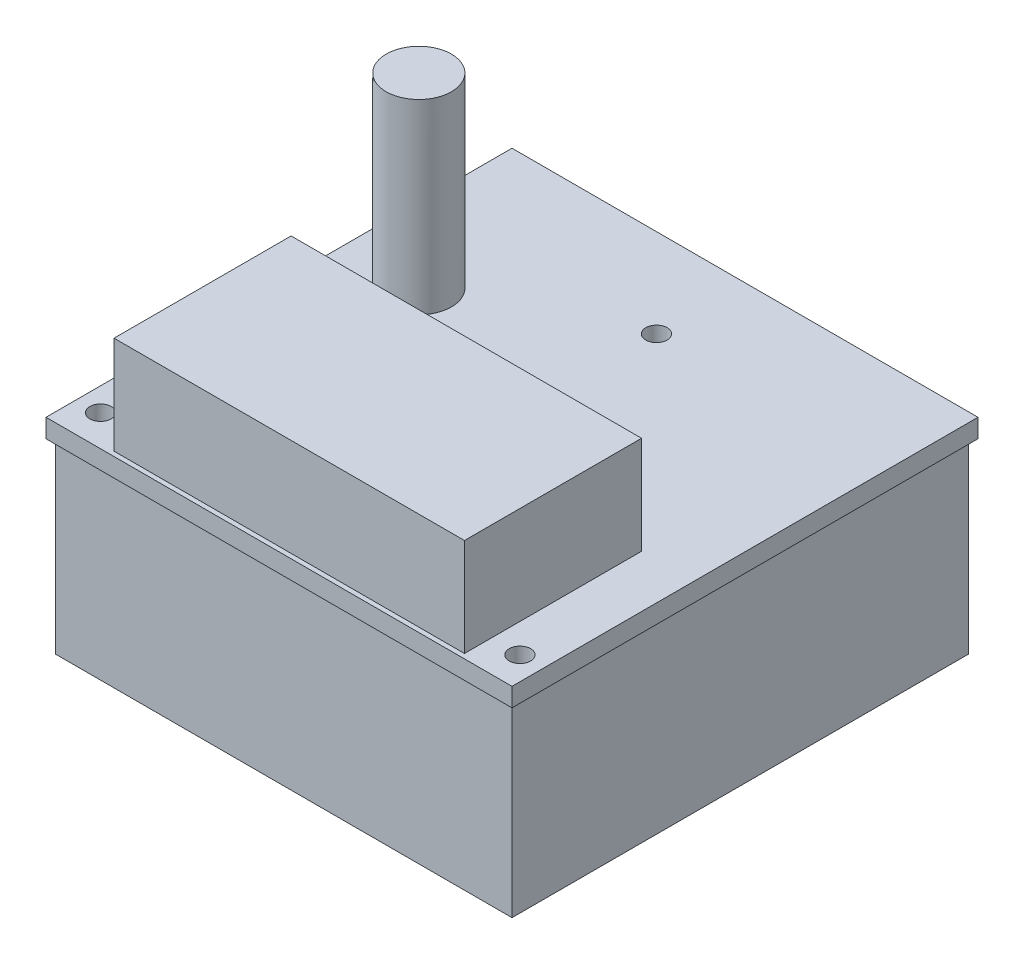
ISO-10303-21;
HEADER;
FILE_DESCRIPTION(('STEP AP214'),'2;1');
FILE_NAME('part.step','',(''),(''),'','','');
FILE_SCHEMA(('AUTOMOTIVE_DESIGN { 1 0 10303 214 1 1 1 1 }'));
ENDSEC;
DATA;
#1=APPLICATION_CONTEXT('core data for automotive mechanical design processes');
#2=APPLICATION_PROTOCOL_DEFINITION('international standard','automotive_design',2000,#1);
#3=PRODUCT_CONTEXT('',#1,'mechanical');
#4=PRODUCT('Part','Part','',(#3));
#5=PRODUCT_RELATED_PRODUCT_CATEGORY('part','',(#4));
#6=PRODUCT_DEFINITION_FORMATION('','',#4);
#7=PRODUCT_DEFINITION_CONTEXT('part definition',#1,'design');
#8=PRODUCT_DEFINITION('design','',#6,#7);
#9=PRODUCT_DEFINITION_SHAPE('','',#8);
#10=(LENGTH_UNIT() NAMED_UNIT(*) SI_UNIT(.MILLI.,.METRE.));
#11=(NAMED_UNIT(*) PLANE_ANGLE_UNIT() SI_UNIT($,.RADIAN.));
#12=(NAMED_UNIT(*) SI_UNIT($,.STERADIAN.) SOLID_ANGLE_UNIT());
#13=UNCERTAINTY_MEASURE_WITH_UNIT(LENGTH_MEASURE(1.E-05),#10,'distance_accuracy_value','');
#14=(GEOMETRIC_REPRESENTATION_CONTEXT(3) GLOBAL_UNCERTAINTY_ASSIGNED_CONTEXT((#13)) GLOBAL_UNIT_ASSIGNED_CONTEXT((#10,
#11,#12)) REPRESENTATION_CONTEXT('',''));
#15=CARTESIAN_POINT('',(0.,0.,0.));
#16=DIRECTION('',(0.,0.,1.));
#17=DIRECTION('',(1.,0.,0.));
#18=AXIS2_PLACEMENT_3D('',#15,#16,#17);
#19=CARTESIAN_POINT('',(0.,0.,0.));
#20=DIRECTION('',(0.,-1.,0.));
#21=DIRECTION('',(0.,0.,-1.));
#22=AXIS2_PLACEMENT_3D('',#19,#20,#21);
#23=PLANE('',#22);
#24=DIRECTION('',(0.,0.,1.));
#25=VECTOR('',#24,1.);
#26=CARTESIAN_POINT('',(0.,0.,0.));
#27=LINE('',#26,#25);
#28=CARTESIAN_POINT('',(0.,0.,-50.));
#29=VERTEX_POINT('',#28);
#30=CARTESIAN_POINT('',(0.,0.,0.));
#31=VERTEX_POINT('',#30);
#32=EDGE_CURVE('E202',#29,#31,#27,.T.);
#33=ORIENTED_EDGE('',*,*,#32,.F.);
#34=DIRECTION('',(-1.,0.,0.));
#35=VECTOR('',#34,1.);
#36=CARTESIAN_POINT('',(0.,0.,-50.));
#37=LINE('',#36,#35);
#38=CARTESIAN_POINT('',(50.,0.,-50.));
#39=VERTEX_POINT('',#38);
#40=EDGE_CURVE('E209',#39,#29,#37,.T.);
#41=ORIENTED_EDGE('',*,*,#40,.F.);
#42=DIRECTION('',(0.,0.,-1.));
#43=VECTOR('',#42,1.);
#44=CARTESIAN_POINT('',(50.,0.,0.));
#45=LINE('',#44,#43);
#46=CARTESIAN_POINT('',(50.,0.,0.));
#47=VERTEX_POINT('',#46);
#48=EDGE_CURVE('E220',#47,#39,#45,.T.);
#49=ORIENTED_EDGE('',*,*,#48,.F.);
#50=DIRECTION('',(1.,0.,0.));
#51=VECTOR('',#50,1.);
#52=CARTESIAN_POINT('',(0.,0.,0.));
#53=LINE('',#52,#51);
#54=EDGE_CURVE('E218',#31,#47,#53,.T.);
#55=ORIENTED_EDGE('',*,*,#54,.F.);
#56=EDGE_LOOP('',(#33,#41,#49,#55));
#57=FACE_BOUND('',#56,.T.);
#58=DIRECTION('',(1.,0.,0.));
#59=VECTOR('',#58,1.);
#60=CARTESIAN_POINT('',(0.5,0.,-49.5));
#61=LINE('',#60,#59);
#62=CARTESIAN_POINT('',(0.5,0.,-49.5));
#63=VERTEX_POINT('',#62);
#64=CARTESIAN_POINT('',(49.5,0.,-49.5));
#65=VERTEX_POINT('',#64);
#66=EDGE_CURVE('E396',#63,#65,#61,.T.);
#67=ORIENTED_EDGE('',*,*,#66,.F.);
#68=DIRECTION('',(0.,0.,-1.));
#69=VECTOR('',#68,1.);
#70=CARTESIAN_POINT('',(0.5,0.,-0.5));
#71=LINE('',#70,#69);
#72=CARTESIAN_POINT('',(0.5,0.,-0.5));
#73=VERTEX_POINT('',#72);
#74=EDGE_CURVE('E147',#73,#63,#71,.T.);
#75=ORIENTED_EDGE('',*,*,#74,.F.);
#76=DIRECTION('',(-1.,0.,0.));
#77=VECTOR('',#76,1.);
#78=CARTESIAN_POINT('',(49.5,0.,-0.5));
#79=LINE('',#78,#77);
#80=CARTESIAN_POINT('',(49.5,0.,-0.5));
#81=VERTEX_POINT('',#80);
#82=EDGE_CURVE('E143',#81,#73,#79,.T.);
#83=ORIENTED_EDGE('',*,*,#82,.F.);
#84=DIRECTION('',(0.,0.,1.));
#85=VECTOR('',#84,1.);
#86=CARTESIAN_POINT('',(49.5,0.,-49.5));
#87=LINE('',#86,#85);
#88=EDGE_CURVE('E393',#65,#81,#87,.T.);
#89=ORIENTED_EDGE('',*,*,#88,.F.);
#90=EDGE_LOOP('',(#67,#75,#83,#89));
#91=FACE_BOUND('',#90,.T.);
#92=ADVANCED_FACE('F35',(#57,#91),#23,.T.);
#93=CARTESIAN_POINT('',(0.,2.,0.));
#94=DIRECTION('',(0.,-1.,0.));
#95=DIRECTION('',(0.,0.,-1.));
#96=AXIS2_PLACEMENT_3D('',#93,#94,#95);
#97=PLANE('',#96);
#98=DIRECTION('',(0.,0.,1.));
#99=VECTOR('',#98,1.);
#100=CARTESIAN_POINT('',(6.79999999999999,2.,-0.5));
#101=LINE('',#100,#99);
#102=CARTESIAN_POINT('',(6.79999999999997,2.,-19.5));
#103=VERTEX_POINT('',#102);
#104=CARTESIAN_POINT('',(6.79999999999999,2.,-0.5));
#105=VERTEX_POINT('',#104);
#106=EDGE_CURVE('E152',#103,#105,#101,.T.);
#107=ORIENTED_EDGE('',*,*,#106,.F.);
#108=DIRECTION('',(-1.,0.,0.));
#109=VECTOR('',#108,1.);
#110=CARTESIAN_POINT('',(6.79999999999997,2.,-19.5));
#111=LINE('',#110,#109);
#112=CARTESIAN_POINT('',(44.4,2.,-19.5));
#113=VERTEX_POINT('',#112);
#114=EDGE_CURVE('E161',#113,#103,#111,.T.);
#115=ORIENTED_EDGE('',*,*,#114,.F.);
#116=DIRECTION('',(0.,0.,-1.));
#117=VECTOR('',#116,1.);
#118=CARTESIAN_POINT('',(44.4,2.,-0.5));
#119=LINE('',#118,#117);
#120=CARTESIAN_POINT('',(44.4,2.,-0.5));
#121=VERTEX_POINT('',#120);
#122=EDGE_CURVE('E171',#121,#113,#119,.T.);
#123=ORIENTED_EDGE('',*,*,#122,.F.);
#124=DIRECTION('',(1.,0.,0.));
#125=VECTOR('',#124,1.);
#126=CARTESIAN_POINT('',(6.79999999999999,2.,-0.5));
#127=LINE('',#126,#125);
#128=EDGE_CURVE('E58',#105,#121,#127,.T.);
#129=ORIENTED_EDGE('',*,*,#128,.F.);
#130=EDGE_LOOP('',(#107,#115,#123,#129));
#131=FACE_BOUND('',#130,.T.);
#132=CARTESIAN_POINT('',(47.5,2.,-3.35));
#133=DIRECTION('',(0.,1.,0.));
#134=DIRECTION('',(0.,0.,1.));
#135=AXIS2_PLACEMENT_3D('',#132,#133,#134);
#136=CIRCLE('',#135,1.15);
#137=CARTESIAN_POINT('',(47.5,2.,-2.2));
#138=VERTEX_POINT('',#137);
#139=EDGE_CURVE('E193',#138,#138,#136,.T.);
#140=ORIENTED_EDGE('',*,*,#139,.F.);
#141=EDGE_LOOP('',(#140));
#142=FACE_BOUND('',#141,.T.);
#143=DIRECTION('',(0.,0.,1.));
#144=VECTOR('',#143,1.);
#145=CARTESIAN_POINT('',(0.,2.,0.));
#146=LINE('',#145,#144);
#147=CARTESIAN_POINT('',(0.,2.,-50.));
#148=VERTEX_POINT('',#147);
#149=CARTESIAN_POINT('',(0.,2.,0.));
#150=VERTEX_POINT('',#149);
#151=EDGE_CURVE('E205',#148,#150,#146,.T.);
#152=ORIENTED_EDGE('',*,*,#151,.T.);
#153=DIRECTION('',(1.,0.,0.));
#154=VECTOR('',#153,1.);
#155=CARTESIAN_POINT('',(0.,2.,0.));
#156=LINE('',#155,#154);
#157=CARTESIAN_POINT('',(50.,2.,0.));
#158=VERTEX_POINT('',#157);
#159=EDGE_CURVE('E208',#150,#158,#156,.T.);
#160=ORIENTED_EDGE('',*,*,#159,.T.);
#161=DIRECTION('',(0.,0.,-1.));
#162=VECTOR('',#161,1.);
#163=CARTESIAN_POINT('',(50.,2.,0.));
#164=LINE('',#163,#162);
#165=CARTESIAN_POINT('',(50.,2.,-50.));
#166=VERTEX_POINT('',#165);
#167=EDGE_CURVE('E211',#158,#166,#164,.T.);
#168=ORIENTED_EDGE('',*,*,#167,.T.);
#169=DIRECTION('',(-1.,0.,0.));
#170=VECTOR('',#169,1.);
#171=CARTESIAN_POINT('',(0.,2.,-50.));
#172=LINE('',#171,#170);
#173=EDGE_CURVE('E213',#166,#148,#172,.T.);
#174=ORIENTED_EDGE('',*,*,#173,.T.);
#175=EDGE_LOOP('',(#152,#160,#168,#174));
#176=FACE_BOUND('',#175,.T.);
#177=CARTESIAN_POINT('',(2.5,2.,-3.35));
#178=DIRECTION('',(0.,1.,0.));
#179=DIRECTION('',(0.,0.,1.));
#180=AXIS2_PLACEMENT_3D('',#177,#178,#179);
#181=CIRCLE('',#180,1.15);
#182=CARTESIAN_POINT('',(2.5,2.,-2.2));
#183=VERTEX_POINT('',#182);
#184=EDGE_CURVE('E199',#183,#183,#181,.T.);
#185=ORIENTED_EDGE('',*,*,#184,.F.);
#186=EDGE_LOOP('',(#185));
#187=FACE_BOUND('',#186,.T.);
#188=CARTESIAN_POINT('',(25.,2.,-40.5));
#189=DIRECTION('',(0.,1.,0.));
#190=DIRECTION('',(0.,0.,1.));
#191=AXIS2_PLACEMENT_3D('',#188,#189,#190);
#192=CIRCLE('',#191,1.15);
#193=CARTESIAN_POINT('',(25.,2.,-39.35));
#194=VERTEX_POINT('',#193);
#195=EDGE_CURVE('E187',#194,#194,#192,.T.);
#196=ORIENTED_EDGE('',*,*,#195,.F.);
#197=EDGE_LOOP('',(#196));
#198=FACE_BOUND('',#197,.T.);
#199=CARTESIAN_POINT('',(7.99999999999999,2.,-32.));
#200=DIRECTION('',(0.,-1.,0.));
#201=DIRECTION('',(0.,0.,-1.));
#202=AXIS2_PLACEMENT_3D('',#199,#200,#201);
#203=CIRCLE('',#202,3.5);
#204=CARTESIAN_POINT('',(7.99999999999999,2.,-35.5));
#205=VERTEX_POINT('',#204);
#206=EDGE_CURVE('E11',#205,#205,#203,.F.);
#207=ORIENTED_EDGE('',*,*,#206,.F.);
#208=EDGE_LOOP('',(#207));
#209=FACE_BOUND('',#208,.T.);
#210=ADVANCED_FACE('F251',(#131,#142,#176,#187,#198,#209),#97,.F.);
#211=CARTESIAN_POINT('',(0.,2.,0.));
#212=DIRECTION('',(1.,0.,0.));
#213=DIRECTION('',(0.,0.,-1.));
#214=AXIS2_PLACEMENT_3D('',#211,#212,#213);
#215=PLANE('',#214);
#216=ORIENTED_EDGE('',*,*,#32,.T.);
#217=DIRECTION('',(0.,-1.,0.));
#218=VECTOR('',#217,1.);
#219=CARTESIAN_POINT('',(0.,2.,0.));
#220=LINE('',#219,#218);
#221=EDGE_CURVE('E43',#150,#31,#220,.T.);
#222=ORIENTED_EDGE('',*,*,#221,.F.);
#223=ORIENTED_EDGE('',*,*,#151,.F.);
#224=DIRECTION('',(0.,-1.,0.));
#225=VECTOR('',#224,1.);
#226=CARTESIAN_POINT('',(0.,2.,-50.));
#227=LINE('',#226,#225);
#228=EDGE_CURVE('E215',#148,#29,#227,.T.);
#229=ORIENTED_EDGE('',*,*,#228,.T.);
#230=EDGE_LOOP('',(#216,#222,#223,#229));
#231=FACE_BOUND('',#230,.T.);
#232=ADVANCED_FACE('F37',(#231),#215,.F.);
#233=CARTESIAN_POINT('',(0.,2.,0.));
#234=DIRECTION('',(0.,0.,-1.));
#235=DIRECTION('',(-1.,0.,0.));
#236=AXIS2_PLACEMENT_3D('',#233,#234,#235);
#237=PLANE('',#236);
#238=ORIENTED_EDGE('',*,*,#54,.T.);
#239=DIRECTION('',(0.,-1.,0.));
#240=VECTOR('',#239,1.);
#241=CARTESIAN_POINT('',(50.,2.,0.));
#242=LINE('',#241,#240);
#243=EDGE_CURVE('E228',#158,#47,#242,.T.);
#244=ORIENTED_EDGE('',*,*,#243,.F.);
#245=ORIENTED_EDGE('',*,*,#159,.F.);
#246=ORIENTED_EDGE('',*,*,#221,.T.);
#247=EDGE_LOOP('',(#238,#244,#245,#246));
#248=FACE_BOUND('',#247,.T.);
#249=ADVANCED_FACE('F233',(#248),#237,.F.);
#250=CARTESIAN_POINT('',(50.,2.,0.));
#251=DIRECTION('',(-1.,0.,0.));
#252=DIRECTION('',(0.,0.,1.));
#253=AXIS2_PLACEMENT_3D('',#250,#251,#252);
#254=PLANE('',#253);
#255=ORIENTED_EDGE('',*,*,#48,.T.);
#256=DIRECTION('',(0.,-1.,0.));
#257=VECTOR('',#256,1.);
#258=CARTESIAN_POINT('',(50.,2.,-50.));
#259=LINE('',#258,#257);
#260=EDGE_CURVE('E225',#166,#39,#259,.T.);
#261=ORIENTED_EDGE('',*,*,#260,.F.);
#262=ORIENTED_EDGE('',*,*,#167,.F.);
#263=ORIENTED_EDGE('',*,*,#243,.T.);
#264=EDGE_LOOP('',(#255,#261,#262,#263));
#265=FACE_BOUND('',#264,.T.);
#266=ADVANCED_FACE('F245',(#265),#254,.F.);
#267=CARTESIAN_POINT('',(0.,2.,-50.));
#268=DIRECTION('',(0.,0.,1.));
#269=DIRECTION('',(1.,0.,0.));
#270=AXIS2_PLACEMENT_3D('',#267,#268,#269);
#271=PLANE('',#270);
#272=ORIENTED_EDGE('',*,*,#40,.T.);
#273=ORIENTED_EDGE('',*,*,#228,.F.);
#274=ORIENTED_EDGE('',*,*,#173,.F.);
#275=ORIENTED_EDGE('',*,*,#260,.T.);
#276=EDGE_LOOP('',(#272,#273,#274,#275));
#277=FACE_BOUND('',#276,.T.);
#278=ADVANCED_FACE('F249',(#277),#271,.F.);
#279=CARTESIAN_POINT('',(2.5,2.,-3.35));
#280=DIRECTION('',(0.,-1.,0.));
#281=DIRECTION('',(0.,0.,-1.));
#282=AXIS2_PLACEMENT_3D('',#279,#280,#281);
#283=CYLINDRICAL_SURFACE('',#282,1.15);
#284=ORIENTED_EDGE('',*,*,#184,.T.);
#285=EDGE_LOOP('',(#284));
#286=FACE_BOUND('',#285,.T.);
#287=CARTESIAN_POINT('',(2.5,0.,-3.35));
#288=DIRECTION('',(0.,1.,0.));
#289=DIRECTION('',(0.,0.,1.));
#290=AXIS2_PLACEMENT_3D('',#287,#288,#289);
#291=CIRCLE('',#290,1.15);
#292=CARTESIAN_POINT('',(2.5,0.,-2.2));
#293=VERTEX_POINT('',#292);
#294=EDGE_CURVE('E196',#293,#293,#291,.T.);
#295=ORIENTED_EDGE('',*,*,#294,.F.);
#296=EDGE_LOOP('',(#295));
#297=FACE_BOUND('',#296,.T.);
#298=ADVANCED_FACE('F286',(#286,#297),#283,.F.);
#299=CARTESIAN_POINT('',(47.5,2.,-3.35));
#300=DIRECTION('',(0.,-1.,0.));
#301=DIRECTION('',(0.,0.,-1.));
#302=AXIS2_PLACEMENT_3D('',#299,#300,#301);
#303=CYLINDRICAL_SURFACE('',#302,1.15);
#304=ORIENTED_EDGE('',*,*,#139,.T.);
#305=EDGE_LOOP('',(#304));
#306=FACE_BOUND('',#305,.T.);
#307=CARTESIAN_POINT('',(47.5,0.,-3.35));
#308=DIRECTION('',(0.,1.,0.));
#309=DIRECTION('',(0.,0.,1.));
#310=AXIS2_PLACEMENT_3D('',#307,#308,#309);
#311=CIRCLE('',#310,1.15);
#312=CARTESIAN_POINT('',(47.5,0.,-2.2));
#313=VERTEX_POINT('',#312);
#314=EDGE_CURVE('E190',#313,#313,#311,.T.);
#315=ORIENTED_EDGE('',*,*,#314,.F.);
#316=EDGE_LOOP('',(#315));
#317=FACE_BOUND('',#316,.T.);
#318=ADVANCED_FACE('F405',(#306,#317),#303,.F.);
#319=CARTESIAN_POINT('',(25.,2.,-40.5));
#320=DIRECTION('',(0.,-1.,0.));
#321=DIRECTION('',(0.,0.,-1.));
#322=AXIS2_PLACEMENT_3D('',#319,#320,#321);
#323=CYLINDRICAL_SURFACE('',#322,1.15);
#324=ORIENTED_EDGE('',*,*,#195,.T.);
#325=EDGE_LOOP('',(#324));
#326=FACE_BOUND('',#325,.T.);
#327=CARTESIAN_POINT('',(25.,0.,-40.5));
#328=DIRECTION('',(0.,1.,0.));
#329=DIRECTION('',(0.,0.,1.));
#330=AXIS2_PLACEMENT_3D('',#327,#328,#329);
#331=CIRCLE('',#330,1.15);
#332=CARTESIAN_POINT('',(25.,0.,-39.35));
#333=VERTEX_POINT('',#332);
#334=EDGE_CURVE('E186',#333,#333,#331,.T.);
#335=ORIENTED_EDGE('',*,*,#334,.F.);
#336=EDGE_LOOP('',(#335));
#337=FACE_BOUND('',#336,.T.);
#338=ADVANCED_FACE('F410',(#326,#337),#323,.F.);
#339=CARTESIAN_POINT('',(6.79999999999999,12.5,-0.5));
#340=DIRECTION('',(1.,0.,0.));
#341=DIRECTION('',(0.,0.,-1.));
#342=AXIS2_PLACEMENT_3D('',#339,#340,#341);
#343=PLANE('',#342);
#344=ORIENTED_EDGE('',*,*,#106,.T.);
#345=DIRECTION('',(0.,-1.,0.));
#346=VECTOR('',#345,1.);
#347=CARTESIAN_POINT('',(6.79999999999999,12.5,-0.5));
#348=LINE('',#347,#346);
#349=CARTESIAN_POINT('',(6.79999999999999,12.5,-0.5));
#350=VERTEX_POINT('',#349);
#351=EDGE_CURVE('E184',#350,#105,#348,.T.);
#352=ORIENTED_EDGE('',*,*,#351,.F.);
#353=DIRECTION('',(0.,0.,1.));
#354=VECTOR('',#353,1.);
#355=CARTESIAN_POINT('',(6.79999999999999,12.5,-0.5));
#356=LINE('',#355,#354);
#357=CARTESIAN_POINT('',(6.79999999999997,12.5,-19.5));
#358=VERTEX_POINT('',#357);
#359=EDGE_CURVE('E157',#358,#350,#356,.T.);
#360=ORIENTED_EDGE('',*,*,#359,.F.);
#361=DIRECTION('',(0.,-1.,0.));
#362=VECTOR('',#361,1.);
#363=CARTESIAN_POINT('',(6.79999999999997,12.5,-19.5));
#364=LINE('',#363,#362);
#365=EDGE_CURVE('E167',#358,#103,#364,.T.);
#366=ORIENTED_EDGE('',*,*,#365,.T.);
#367=EDGE_LOOP('',(#344,#352,#360,#366));
#368=FACE_BOUND('',#367,.T.);
#369=ADVANCED_FACE('F416',(#368),#343,.F.);
#370=CARTESIAN_POINT('',(6.79999999999999,12.5,-0.5));
#371=DIRECTION('',(0.,0.,-1.));
#372=DIRECTION('',(-1.,0.,0.));
#373=AXIS2_PLACEMENT_3D('',#370,#371,#372);
#374=PLANE('',#373);
#375=ORIENTED_EDGE('',*,*,#128,.T.);
#376=DIRECTION('',(0.,-1.,0.));
#377=VECTOR('',#376,1.);
#378=CARTESIAN_POINT('',(44.4,12.5,-0.5));
#379=LINE('',#378,#377);
#380=CARTESIAN_POINT('',(44.4,12.5,-0.5));
#381=VERTEX_POINT('',#380);
#382=EDGE_CURVE('E181',#381,#121,#379,.T.);
#383=ORIENTED_EDGE('',*,*,#382,.F.);
#384=DIRECTION('',(1.,0.,0.));
#385=VECTOR('',#384,1.);
#386=CARTESIAN_POINT('',(6.79999999999999,12.5,-0.5));
#387=LINE('',#386,#385);
#388=EDGE_CURVE('E160',#350,#381,#387,.T.);
#389=ORIENTED_EDGE('',*,*,#388,.F.);
#390=ORIENTED_EDGE('',*,*,#351,.T.);
#391=EDGE_LOOP('',(#375,#383,#389,#390));
#392=FACE_BOUND('',#391,.T.);
#393=ADVANCED_FACE('F420',(#392),#374,.F.);
#394=CARTESIAN_POINT('',(44.4,12.5,-0.5));
#395=DIRECTION('',(-1.,0.,0.));
#396=DIRECTION('',(0.,0.,1.));
#397=AXIS2_PLACEMENT_3D('',#394,#395,#396);
#398=PLANE('',#397);
#399=ORIENTED_EDGE('',*,*,#122,.T.);
#400=DIRECTION('',(0.,-1.,0.));
#401=VECTOR('',#400,1.);
#402=CARTESIAN_POINT('',(44.4,12.5,-19.5));
#403=LINE('',#402,#401);
#404=CARTESIAN_POINT('',(44.4,12.5,-19.5));
#405=VERTEX_POINT('',#404);
#406=EDGE_CURVE('E178',#405,#113,#403,.T.);
#407=ORIENTED_EDGE('',*,*,#406,.F.);
#408=DIRECTION('',(0.,0.,-1.));
#409=VECTOR('',#408,1.);
#410=CARTESIAN_POINT('',(44.4,12.5,-0.5));
#411=LINE('',#410,#409);
#412=EDGE_CURVE('E163',#381,#405,#411,.T.);
#413=ORIENTED_EDGE('',*,*,#412,.F.);
#414=ORIENTED_EDGE('',*,*,#382,.T.);
#415=EDGE_LOOP('',(#399,#407,#413,#414));
#416=FACE_BOUND('',#415,.T.);
#417=ADVANCED_FACE('F424',(#416),#398,.F.);
#418=CARTESIAN_POINT('',(6.79999999999997,12.5,-19.5));
#419=DIRECTION('',(0.,0.,1.));
#420=DIRECTION('',(1.,0.,0.));
#421=AXIS2_PLACEMENT_3D('',#418,#419,#420);
#422=PLANE('',#421);
#423=ORIENTED_EDGE('',*,*,#114,.T.);
#424=ORIENTED_EDGE('',*,*,#365,.F.);
#425=DIRECTION('',(-1.,0.,0.));
#426=VECTOR('',#425,1.);
#427=CARTESIAN_POINT('',(6.79999999999997,12.5,-19.5));
#428=LINE('',#427,#426);
#429=EDGE_CURVE('E165',#405,#358,#428,.T.);
#430=ORIENTED_EDGE('',*,*,#429,.F.);
#431=ORIENTED_EDGE('',*,*,#406,.T.);
#432=EDGE_LOOP('',(#423,#424,#430,#431));
#433=FACE_BOUND('',#432,.T.);
#434=ADVANCED_FACE('F274',(#433),#422,.F.);
#435=CARTESIAN_POINT('',(0.,12.5,0.));
#436=DIRECTION('',(0.,-1.,0.));
#437=DIRECTION('',(0.,0.,-1.));
#438=AXIS2_PLACEMENT_3D('',#435,#436,#437);
#439=PLANE('',#438);
#440=ORIENTED_EDGE('',*,*,#359,.T.);
#441=ORIENTED_EDGE('',*,*,#388,.T.);
#442=ORIENTED_EDGE('',*,*,#412,.T.);
#443=ORIENTED_EDGE('',*,*,#429,.T.);
#444=EDGE_LOOP('',(#440,#441,#442,#443));
#445=FACE_BOUND('',#444,.T.);
#446=ADVANCED_FACE('F264',(#445),#439,.F.);
#447=CARTESIAN_POINT('',(7.99999999999999,22.,-32.));
#448=DIRECTION('',(0.,-1.,0.));
#449=DIRECTION('',(0.,0.,-1.));
#450=AXIS2_PLACEMENT_3D('',#447,#448,#449);
#451=CYLINDRICAL_SURFACE('',#450,3.5);
#452=CARTESIAN_POINT('',(7.99999999999999,22.,-32.));
#453=DIRECTION('',(0.,1.,0.));
#454=DIRECTION('',(0.,0.,1.));
#455=AXIS2_PLACEMENT_3D('',#452,#453,#454);
#456=CIRCLE('',#455,3.5);
#457=CARTESIAN_POINT('',(7.99999999999999,22.,-28.5));
#458=VERTEX_POINT('',#457);
#459=EDGE_CURVE('E149',#458,#458,#456,.T.);
#460=ORIENTED_EDGE('',*,*,#459,.F.);
#461=EDGE_LOOP('',(#460));
#462=FACE_BOUND('',#461,.T.);
#463=ORIENTED_EDGE('',*,*,#206,.T.);
#464=EDGE_LOOP('',(#463));
#465=FACE_BOUND('',#464,.T.);
#466=ADVANCED_FACE('F261',(#462,#465),#451,.T.);
#467=CARTESIAN_POINT('',(7.99999999999999,22.,-32.));
#468=DIRECTION('',(0.,1.,0.));
#469=DIRECTION('',(0.,0.,1.));
#470=AXIS2_PLACEMENT_3D('',#467,#468,#469);
#471=PLANE('',#470);
#472=ORIENTED_EDGE('',*,*,#459,.T.);
#473=EDGE_LOOP('',(#472));
#474=FACE_BOUND('',#473,.T.);
#475=ADVANCED_FACE('F263',(#474),#471,.T.);
#476=CARTESIAN_POINT('',(0.,0.,0.));
#477=DIRECTION('',(0.,-1.,0.));
#478=DIRECTION('',(0.,0.,-1.));
#479=AXIS2_PLACEMENT_3D('',#476,#477,#478);
#480=PLANE('',#479);
#481=ORIENTED_EDGE('',*,*,#334,.T.);
#482=EDGE_LOOP('',(#481));
#483=FACE_BOUND('',#482,.T.);
#484=ADVANCED_FACE('F271',(#483),#480,.F.);
#485=ORIENTED_EDGE('',*,*,#314,.T.);
#486=EDGE_LOOP('',(#485));
#487=FACE_BOUND('',#486,.T.);
#488=ADVANCED_FACE('F325',(#487),#480,.F.);
#489=ORIENTED_EDGE('',*,*,#294,.T.);
#490=EDGE_LOOP('',(#489));
#491=FACE_BOUND('',#490,.T.);
#492=ADVANCED_FACE('F328',(#491),#480,.F.);
#493=CARTESIAN_POINT('',(0.5,-20.,-0.5));
#494=DIRECTION('',(1.,0.,0.));
#495=DIRECTION('',(0.,0.,-1.));
#496=AXIS2_PLACEMENT_3D('',#493,#494,#495);
#497=PLANE('',#496);
#498=ORIENTED_EDGE('',*,*,#74,.T.);
#499=DIRECTION('',(0.,1.,0.));
#500=VECTOR('',#499,1.);
#501=CARTESIAN_POINT('',(0.5,-20.,-49.5));
#502=LINE('',#501,#500);
#503=CARTESIAN_POINT('',(0.5,-20.,-49.5));
#504=VERTEX_POINT('',#503);
#505=EDGE_CURVE('E128',#504,#63,#502,.T.);
#506=ORIENTED_EDGE('',*,*,#505,.F.);
#507=DIRECTION('',(0.,0.,-1.));
#508=VECTOR('',#507,1.);
#509=CARTESIAN_POINT('',(0.5,-20.,-0.5));
#510=LINE('',#509,#508);
#511=CARTESIAN_POINT('',(0.5,-20.,-0.5));
#512=VERTEX_POINT('',#511);
#513=EDGE_CURVE('E135',#512,#504,#510,.T.);
#514=ORIENTED_EDGE('',*,*,#513,.F.);
#515=DIRECTION('',(0.,1.,0.));
#516=VECTOR('',#515,1.);
#517=CARTESIAN_POINT('',(0.5,-20.,-0.5));
#518=LINE('',#517,#516);
#519=EDGE_CURVE('E391',#512,#73,#518,.T.);
#520=ORIENTED_EDGE('',*,*,#519,.T.);
#521=EDGE_LOOP('',(#498,#506,#514,#520));
#522=FACE_BOUND('',#521,.T.);
#523=ADVANCED_FACE('F145',(#522),#497,.F.);
#524=CARTESIAN_POINT('',(0.5,-20.,-49.5));
#525=DIRECTION('',(0.,0.,1.));
#526=DIRECTION('',(1.,0.,0.));
#527=AXIS2_PLACEMENT_3D('',#524,#525,#526);
#528=PLANE('',#527);
#529=ORIENTED_EDGE('',*,*,#66,.T.);
#530=DIRECTION('',(0.,1.,0.));
#531=VECTOR('',#530,1.);
#532=CARTESIAN_POINT('',(49.5,-20.,-49.5));
#533=LINE('',#532,#531);
#534=CARTESIAN_POINT('',(49.5,-20.,-49.5));
#535=VERTEX_POINT('',#534);
#536=EDGE_CURVE('E131',#535,#65,#533,.T.);
#537=ORIENTED_EDGE('',*,*,#536,.F.);
#538=DIRECTION('',(1.,0.,0.));
#539=VECTOR('',#538,1.);
#540=CARTESIAN_POINT('',(0.5,-20.,-49.5));
#541=LINE('',#540,#539);
#542=EDGE_CURVE('E124',#504,#535,#541,.T.);
#543=ORIENTED_EDGE('',*,*,#542,.F.);
#544=ORIENTED_EDGE('',*,*,#505,.T.);
#545=EDGE_LOOP('',(#529,#537,#543,#544));
#546=FACE_BOUND('',#545,.T.);
#547=ADVANCED_FACE('F126',(#546),#528,.F.);
#548=CARTESIAN_POINT('',(49.5,-20.,-49.5));
#549=DIRECTION('',(-1.,0.,0.));
#550=DIRECTION('',(0.,0.,1.));
#551=AXIS2_PLACEMENT_3D('',#548,#549,#550);
#552=PLANE('',#551);
#553=ORIENTED_EDGE('',*,*,#88,.T.);
#554=DIRECTION('',(0.,1.,0.));
#555=VECTOR('',#554,1.);
#556=CARTESIAN_POINT('',(49.5,-20.,-0.5));
#557=LINE('',#556,#555);
#558=CARTESIAN_POINT('',(49.5,-20.,-0.5));
#559=VERTEX_POINT('',#558);
#560=EDGE_CURVE('E50',#559,#81,#557,.T.);
#561=ORIENTED_EDGE('',*,*,#560,.F.);
#562=DIRECTION('',(0.,0.,1.));
#563=VECTOR('',#562,1.);
#564=CARTESIAN_POINT('',(49.5,-20.,-49.5));
#565=LINE('',#564,#563);
#566=EDGE_CURVE('E134',#535,#559,#565,.T.);
#567=ORIENTED_EDGE('',*,*,#566,.F.);
#568=ORIENTED_EDGE('',*,*,#536,.T.);
#569=EDGE_LOOP('',(#553,#561,#567,#568));
#570=FACE_BOUND('',#569,.T.);
#571=ADVANCED_FACE('F360',(#570),#552,.F.);
#572=CARTESIAN_POINT('',(49.5,-20.,-0.5));
#573=DIRECTION('',(0.,0.,-1.));
#574=DIRECTION('',(-1.,0.,0.));
#575=AXIS2_PLACEMENT_3D('',#572,#573,#574);
#576=PLANE('',#575);
#577=ORIENTED_EDGE('',*,*,#82,.T.);
#578=ORIENTED_EDGE('',*,*,#519,.F.);
#579=DIRECTION('',(-1.,0.,0.));
#580=VECTOR('',#579,1.);
#581=CARTESIAN_POINT('',(49.5,-20.,-0.5));
#582=LINE('',#581,#580);
#583=EDGE_CURVE('E139',#559,#512,#582,.T.);
#584=ORIENTED_EDGE('',*,*,#583,.F.);
#585=ORIENTED_EDGE('',*,*,#560,.T.);
#586=EDGE_LOOP('',(#577,#578,#584,#585));
#587=FACE_BOUND('',#586,.T.);
#588=ADVANCED_FACE('F369',(#587),#576,.F.);
#589=CARTESIAN_POINT('',(0.,-20.,0.));
#590=DIRECTION('',(0.,-1.,0.));
#591=DIRECTION('',(0.,0.,-1.));
#592=AXIS2_PLACEMENT_3D('',#589,#590,#591);
#593=PLANE('',#592);
#594=ORIENTED_EDGE('',*,*,#513,.T.);
#595=ORIENTED_EDGE('',*,*,#542,.T.);
#596=ORIENTED_EDGE('',*,*,#566,.T.);
#597=ORIENTED_EDGE('',*,*,#583,.T.);
#598=EDGE_LOOP('',(#594,#595,#596,#597));
#599=FACE_BOUND('',#598,.T.);
#600=ADVANCED_FACE('F138',(#599),#593,.T.);
#601=CLOSED_SHELL('',(#92,#210,#232,#249,#266,#278,#298,#318,#338,#369,#393,#417,#434,#446,#466,
#475,#484,#488,#492,#523,#547,#571,#588,#600));
#602=MANIFOLD_SOLID_BREP('B2',#601);
#603=ADVANCED_BREP_SHAPE_REPRESENTATION('',(#18,#602),#14);
#604=SHAPE_DEFINITION_REPRESENTATION(#9,#603);
ENDSEC;
END-ISO-10303-21;
